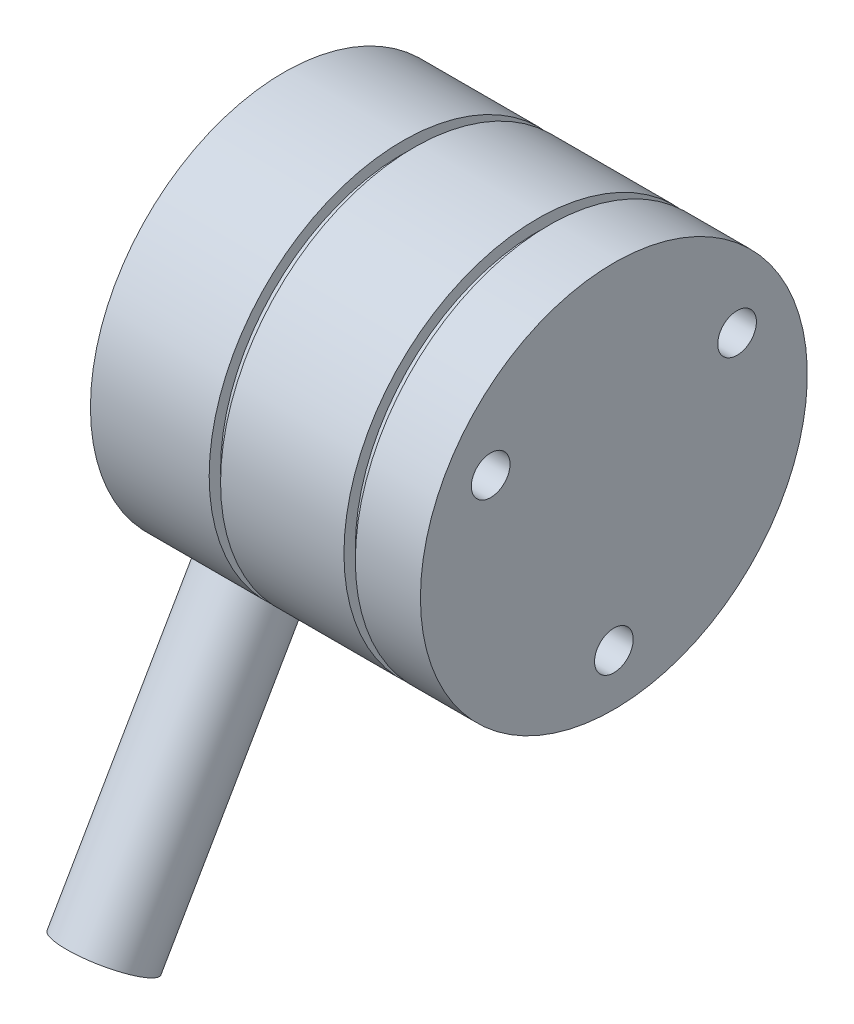
ISO-10303-21;
HEADER;
FILE_DESCRIPTION(('STEP AP214'),'2;1');
FILE_NAME('part.step','',(''),(''),'','','');
FILE_SCHEMA(('AUTOMOTIVE_DESIGN { 1 0 10303 214 1 1 1 1 }'));
ENDSEC;
DATA;
#1=APPLICATION_CONTEXT('core data for automotive mechanical design processes');
#2=APPLICATION_PROTOCOL_DEFINITION('international standard','automotive_design',2000,#1);
#3=PRODUCT_CONTEXT('',#1,'mechanical');
#4=PRODUCT('Part','Part','',(#3));
#5=PRODUCT_RELATED_PRODUCT_CATEGORY('part','',(#4));
#6=PRODUCT_DEFINITION_FORMATION('','',#4);
#7=PRODUCT_DEFINITION_CONTEXT('part definition',#1,'design');
#8=PRODUCT_DEFINITION('design','',#6,#7);
#9=PRODUCT_DEFINITION_SHAPE('','',#8);
#10=(LENGTH_UNIT() NAMED_UNIT(*) SI_UNIT(.MILLI.,.METRE.));
#11=(NAMED_UNIT(*) PLANE_ANGLE_UNIT() SI_UNIT($,.RADIAN.));
#12=(NAMED_UNIT(*) SI_UNIT($,.STERADIAN.) SOLID_ANGLE_UNIT());
#13=UNCERTAINTY_MEASURE_WITH_UNIT(LENGTH_MEASURE(1.E-05),#10,'distance_accuracy_value','');
#14=(GEOMETRIC_REPRESENTATION_CONTEXT(3) GLOBAL_UNCERTAINTY_ASSIGNED_CONTEXT((#13)) GLOBAL_UNIT_ASSIGNED_CONTEXT((#10,
#11,#12)) REPRESENTATION_CONTEXT('',''));
#15=CARTESIAN_POINT('',(0.,0.,0.));
#16=DIRECTION('',(0.,0.,1.));
#17=DIRECTION('',(1.,0.,0.));
#18=AXIS2_PLACEMENT_3D('',#15,#16,#17);
#19=CARTESIAN_POINT('',(0.,0.,0.));
#20=DIRECTION('',(1.,0.,0.));
#21=DIRECTION('',(0.,0.,-1.));
#22=AXIS2_PLACEMENT_3D('',#19,#20,#21);
#23=PLANE('',#22);
#24=CARTESIAN_POINT('',(0.,-5.11970027680622,-3.584852727194));
#25=DIRECTION('',(-1.,0.,0.));
#26=DIRECTION('',(0.,0.,1.));
#27=AXIS2_PLACEMENT_3D('',#24,#25,#26);
#28=CIRCLE('',#27,0.85);
#29=CARTESIAN_POINT('',(0.,-5.11970027680622,-2.734852727194));
#30=VERTEX_POINT('',#29);
#31=EDGE_CURVE('E83',#30,#30,#28,.T.);
#32=ORIENTED_EDGE('',*,*,#31,.F.);
#33=EDGE_LOOP('',(#32));
#34=FACE_BOUND('',#33,.T.);
#35=CARTESIAN_POINT('',(0.,-0.54472339217282,6.22621686307341));
#36=DIRECTION('',(-1.,0.,0.));
#37=DIRECTION('',(0.,0.,1.));
#38=AXIS2_PLACEMENT_3D('',#35,#36,#37);
#39=CIRCLE('',#38,0.850000000000001);
#40=CARTESIAN_POINT('',(0.,-0.54472339217282,7.07621686307341));
#41=VERTEX_POINT('',#40);
#42=EDGE_CURVE('E77',#41,#41,#39,.T.);
#43=ORIENTED_EDGE('',*,*,#42,.F.);
#44=EDGE_LOOP('',(#43));
#45=FACE_BOUND('',#44,.T.);
#46=CARTESIAN_POINT('',(0.,5.66442366897904,-2.64136413587941));
#47=DIRECTION('',(-1.,0.,0.));
#48=DIRECTION('',(0.,0.,1.));
#49=AXIS2_PLACEMENT_3D('',#46,#47,#48);
#50=CIRCLE('',#49,0.85);
#51=CARTESIAN_POINT('',(0.,5.66442366897904,-1.79136413587941));
#52=VERTEX_POINT('',#51);
#53=EDGE_CURVE('E71',#52,#52,#50,.T.);
#54=ORIENTED_EDGE('',*,*,#53,.F.);
#55=EDGE_LOOP('',(#54));
#56=FACE_BOUND('',#55,.T.);
#57=CARTESIAN_POINT('',(0.,0.,0.));
#58=DIRECTION('',(-1.,0.,0.));
#59=DIRECTION('',(0.,0.,1.));
#60=AXIS2_PLACEMENT_3D('',#57,#58,#59);
#61=CIRCLE('',#60,8.5);
#62=CARTESIAN_POINT('',(0.,0.,8.5));
#63=VERTEX_POINT('',#62);
#64=EDGE_CURVE('E10',#63,#63,#61,.T.);
#65=ORIENTED_EDGE('',*,*,#64,.T.);
#66=EDGE_LOOP('',(#65));
#67=FACE_BOUND('',#66,.T.);
#68=ADVANCED_FACE('F30',(#34,#45,#56,#67),#23,.F.);
#69=CARTESIAN_POINT('',(0.,0.,0.));
#70=DIRECTION('',(-1.,0.,0.));
#71=DIRECTION('',(0.,0.,1.));
#72=AXIS2_PLACEMENT_3D('',#69,#70,#71);
#73=CYLINDRICAL_SURFACE('',#72,8.5);
#74=CARTESIAN_POINT('',(2.69450578163428,-8.12495644586084,2.49701476825114));
#75=CARTESIAN_POINT('',(2.58922245366517,-8.12495651681742,2.49701889667136));
#76=CARTESIAN_POINT('',(2.48389710071612,-8.12232301708844,2.5056334997405));
#77=CARTESIAN_POINT('',(2.2762459099473,-8.11172218820042,2.53973826617043));
#78=CARTESIAN_POINT('',(2.17392223132134,-8.10375111323153,2.56524028065942));
#79=CARTESIAN_POINT('',(1.9753081137902,-8.08230627577559,2.6320230588623));
#80=CARTESIAN_POINT('',(1.87901102771537,-8.06883870370085,2.67328606846508));
#81=CARTESIAN_POINT('',(1.69490513126177,-8.03615154267094,2.76999319739295));
#82=CARTESIAN_POINT('',(1.60709622547668,-8.0169320183771,2.8254371573));
#83=CARTESIAN_POINT('',(1.44090981250331,-7.97212522983649,2.94951297408446));
#84=CARTESIAN_POINT('',(1.3627038254352,-7.94644187807409,3.01833990497959));
#85=CARTESIAN_POINT('',(1.21944670283871,-7.88867374574937,3.16624683806223));
#86=CARTESIAN_POINT('',(1.15439661829619,-7.85658845416159,3.24532765857489));
#87=CARTESIAN_POINT('',(1.03861595528015,-7.7856278404833,3.41207950109189));
#88=CARTESIAN_POINT('',(0.98805086604998,-7.74668167035503,3.49983549159466));
#89=CARTESIAN_POINT('',(0.903746981366496,-7.66258210802083,3.68031700081662));
#90=CARTESIAN_POINT('',(0.87000621238659,-7.61742944464207,3.77304193525488));
#91=CARTESIAN_POINT('',(0.82084965729554,-7.52247316644565,3.95892754320848));
#92=CARTESIAN_POINT('',(0.805143428580294,-7.47275761121485,4.0520563353672));
#93=CARTESIAN_POINT('',(0.79159318112935,-7.36926977580575,4.23734792817196));
#94=CARTESIAN_POINT('',(0.793747032000505,-7.31549798022371,4.32951084271711));
#95=CARTESIAN_POINT('',(0.815640565161463,-7.20650130968936,4.50856246954275));
#96=CARTESIAN_POINT('',(0.835067125845551,-7.15131922444454,4.59551579519775));
#97=CARTESIAN_POINT('',(0.890455033090359,-7.04044901861841,4.76363556254191));
#98=CARTESIAN_POINT('',(0.926417148678361,-6.98476087461966,4.84480173488225));
#99=CARTESIAN_POINT('',(1.01412881423263,-6.8744879559509,5.00005593350973));
#100=CARTESIAN_POINT('',(1.06599598872334,-6.81991474727515,5.07408563192728));
#101=CARTESIAN_POINT('',(1.18395753913208,-6.71444623952327,5.21285136042506));
#102=CARTESIAN_POINT('',(1.2500539331897,-6.6635514635308,5.2775860700176));
#103=CARTESIAN_POINT('',(1.39629872096011,-6.56651877210539,5.39786449455218));
#104=CARTESIAN_POINT('',(1.47672112987103,-6.52050817780424,5.45317805558689));
#105=CARTESIAN_POINT('',(1.64844221033773,-6.43669157523898,5.55186508677938));
#106=CARTESIAN_POINT('',(1.73974120370075,-6.39888580982586,5.59523820352756));
#107=CARTESIAN_POINT('',(1.93106201640173,-6.33329046933143,5.66938284197834));
#108=CARTESIAN_POINT('',(2.03111087787931,-6.30553341386585,5.70011349314742));
#109=CARTESIAN_POINT('',(2.23683330933762,-6.26175079790271,5.74817753946655));
#110=CARTESIAN_POINT('',(2.34250593992494,-6.24572328466138,5.7655131646583));
#111=CARTESIAN_POINT('',(2.55406804992012,-6.22654588569099,5.78621838296051));
#112=CARTESIAN_POINT('',(2.65990511419276,-6.22312935656193,5.78987717695539));
#113=CARTESIAN_POINT('',(2.87088002364778,-6.22863159675454,5.7839575032307));
#114=CARTESIAN_POINT('',(2.9760179186281,-6.23754947790143,5.77437998862974));
#115=CARTESIAN_POINT('',(3.18126098151566,-6.26701569172829,5.74238388895449));
#116=CARTESIAN_POINT('',(3.28141254972619,-6.28741764903466,5.7201268737841));
#117=CARTESIAN_POINT('',(3.47535519217186,-6.33864351027918,5.66330756460963));
#118=CARTESIAN_POINT('',(3.56914563443758,-6.36946844791099,5.62874405009685));
#119=CARTESIAN_POINT('',(3.74935942798676,-6.44056102177296,5.54726352757989));
#120=CARTESIAN_POINT('',(3.83564067685837,-6.48097202823825,5.50015747486314));
#121=CARTESIAN_POINT('',(3.99688296720361,-6.569034026753,5.39467349974679));
#122=CARTESIAN_POINT('',(4.07184253496696,-6.6166859597161,5.33629411217963));
#123=CARTESIAN_POINT('',(4.20981266193635,-6.71811308285792,5.20804733191299));
#124=CARTESIAN_POINT('',(4.27256100173142,-6.77198976045306,5.13797768214935));
#125=CARTESIAN_POINT('',(4.38244810520979,-6.88277230435679,4.98859493436632));
#126=CARTESIAN_POINT('',(4.42958761450308,-6.93967802582179,4.909282278116));
#127=CARTESIAN_POINT('',(4.50655845443923,-7.05384342589314,4.7437668746749));
#128=CARTESIAN_POINT('',(4.53650210668557,-7.11109828022495,4.65761312403072));
#129=CARTESIAN_POINT('',(4.57858036882856,-7.22419498330848,4.48018568382163));
#130=CARTESIAN_POINT('',(4.59071768904237,-7.28003704583056,4.38891277564437));
#131=CARTESIAN_POINT('',(4.59671237922055,-7.38726587030784,4.20586647625715));
#132=CARTESIAN_POINT('',(4.59096055430984,-7.43872299913613,4.11414688621883));
#133=CARTESIAN_POINT('',(4.56221742439062,-7.53711609687823,3.93099098523067));
#134=CARTESIAN_POINT('',(4.53922645643417,-7.58405215416576,3.83955466877748));
#135=CARTESIAN_POINT('',(4.47684842254765,-7.67228706691503,3.66005289612105));
#136=CARTESIAN_POINT('',(4.43751903789437,-7.71360508187903,3.57197675980916));
#137=CARTESIAN_POINT('',(4.34363598391497,-7.79027268675741,3.40152839471643));
#138=CARTESIAN_POINT('',(4.28908076702162,-7.82562166938749,3.31915674680769));
#139=CARTESIAN_POINT('',(4.16503233513158,-7.89080892129708,3.16110656892246));
#140=CARTESIAN_POINT('',(4.09526564846552,-7.92052471361278,3.08559214508521));
#141=CARTESIAN_POINT('',(3.94332337510274,-7.97364754693132,2.94560078491046));
#142=CARTESIAN_POINT('',(3.86114478333421,-7.9970530563062,2.88112652961894));
#143=CARTESIAN_POINT('',(3.68531718535809,-8.03806702926541,2.76466171388173));
#144=CARTESIAN_POINT('',(3.59152275369009,-8.0555890797072,2.71286003938622));
#145=CARTESIAN_POINT('',(3.39603208252516,-8.08465347295204,2.62498318723368));
#146=CARTESIAN_POINT('',(3.29434248038061,-8.09620077735547,2.58889496463575));
#147=CARTESIAN_POINT('',(3.10957317256238,-8.11161159243973,2.54012701860594));
#148=CARTESIAN_POINT('',(3.02748032617213,-8.1166217420282,2.52400052844593));
#149=CARTESIAN_POINT('',(2.86176903472646,-8.12329405153161,2.50244304769207));
#150=CARTESIAN_POINT('',(2.77815067103877,-8.12495638948768,2.49701148832773));
#151=CARTESIAN_POINT('',(2.69450578163428,-8.12495644586084,2.49701476825114));
#152=B_SPLINE_CURVE_WITH_KNOTS('',3,(#74,#75,#76,#77,#78,#79,#80,#81,#82,#83,#84,#85,#86,#87,
#88,#89,#90,#91,#92,#93,#94,#95,#96,#97,#98,#99,#100,#101,#102,#103,#104,#105,#106,#107,#108,
#109,#110,#111,#112,#113,#114,#115,#116,#117,#118,#119,#120,#121,#122,#123,#124,#125,#126,#127,
#128,#129,#130,#131,#132,#133,#134,#135,#136,#137,#138,#139,#140,#141,#142,#143,#144,#145,#146,
#147,#148,#149,#150,#151),.UNSPECIFIED.,.T.,.F.,(4,2,2,2,2,2,2,2,2,2,2,2,2,2,2,2,2,2,2,2,2,2,2,
2,2,2,2,2,2,2,2,2,2,2,2,2,2,2,4),(0.,0.315543347193396,0.631308369172636,0.946718738889866,
1.26212556301287,1.58253088499967,1.90296179311107,2.22691954912922,2.55083929530636,
2.86946579746667,3.18805429364004,3.50098253188484,3.81392532511121,4.12924067692428,
4.44460077961957,4.76681014538855,5.08902904678613,5.4122815826994,5.73548029101679,
6.05180489892881,6.36810673016085,6.68046542759518,6.99285511213133,7.310249616664,
7.62768539997577,7.95132633945162,8.27495181686322,8.5964386309337,8.91787650614,
9.23234197594749,9.5468012976264,9.86015975918354,10.1735500823821,10.4931231513841,
10.812773717275,11.1369324228212,11.4608215038932,11.7115258902928,11.9622169435435),.UNSPECIFIED.);
#153=CARTESIAN_POINT('',(2.69450578163428,-8.12495644586084,2.49701476825114));
#154=VERTEX_POINT('',#153);
#155=EDGE_CURVE('E33',#154,#154,#152,.T.);
#156=ORIENTED_EDGE('',*,*,#155,.T.);
#157=EDGE_LOOP('',(#156));
#158=FACE_BOUND('',#157,.T.);
#159=ORIENTED_EDGE('',*,*,#64,.F.);
#160=EDGE_LOOP('',(#159));
#161=FACE_BOUND('',#160,.T.);
#162=CARTESIAN_POINT('',(5.21775570966465,0.,0.));
#163=DIRECTION('',(-1.,0.,0.));
#164=DIRECTION('',(0.,0.,1.));
#165=AXIS2_PLACEMENT_3D('',#162,#163,#164);
#166=CIRCLE('',#165,8.5);
#167=CARTESIAN_POINT('',(5.21775570966465,0.,8.5));
#168=VERTEX_POINT('',#167);
#169=EDGE_CURVE('E40',#168,#168,#166,.T.);
#170=ORIENTED_EDGE('',*,*,#169,.T.);
#171=EDGE_LOOP('',(#170));
#172=FACE_BOUND('',#171,.T.);
#173=ADVANCED_FACE('F143',(#158,#161,#172),#73,.T.);
#174=CARTESIAN_POINT('',(5.21775570966465,8.5,0.));
#175=DIRECTION('',(-1.,0.,0.));
#176=DIRECTION('',(0.,0.,1.));
#177=AXIS2_PLACEMENT_3D('',#174,#175,#176);
#178=PLANE('',#177);
#179=ORIENTED_EDGE('',*,*,#169,.F.);
#180=EDGE_LOOP('',(#179));
#181=FACE_BOUND('',#180,.T.);
#182=CARTESIAN_POINT('',(5.21775570966465,0.,0.));
#183=DIRECTION('',(-1.,0.,0.));
#184=DIRECTION('',(0.,0.,1.));
#185=AXIS2_PLACEMENT_3D('',#182,#183,#184);
#186=CIRCLE('',#185,8.);
#187=CARTESIAN_POINT('',(5.21775570966465,0.,8.));
#188=VERTEX_POINT('',#187);
#189=EDGE_CURVE('E44',#188,#188,#186,.T.);
#190=ORIENTED_EDGE('',*,*,#189,.T.);
#191=EDGE_LOOP('',(#190));
#192=FACE_BOUND('',#191,.T.);
#193=ADVANCED_FACE('F148',(#181,#192),#178,.F.);
#194=CARTESIAN_POINT('',(0.,0.,0.));
#195=DIRECTION('',(-1.,0.,0.));
#196=DIRECTION('',(0.,0.,1.));
#197=AXIS2_PLACEMENT_3D('',#194,#195,#196);
#198=CYLINDRICAL_SURFACE('',#197,8.);
#199=ORIENTED_EDGE('',*,*,#189,.F.);
#200=EDGE_LOOP('',(#199));
#201=FACE_BOUND('',#200,.T.);
#202=CARTESIAN_POINT('',(5.71775570966465,0.,0.));
#203=DIRECTION('',(-1.,0.,0.));
#204=DIRECTION('',(0.,0.,1.));
#205=AXIS2_PLACEMENT_3D('',#202,#203,#204);
#206=CIRCLE('',#205,8.);
#207=CARTESIAN_POINT('',(5.71775570966465,0.,8.));
#208=VERTEX_POINT('',#207);
#209=EDGE_CURVE('E49',#208,#208,#206,.T.);
#210=ORIENTED_EDGE('',*,*,#209,.T.);
#211=EDGE_LOOP('',(#210));
#212=FACE_BOUND('',#211,.T.);
#213=ADVANCED_FACE('F318',(#201,#212),#198,.T.);
#214=CARTESIAN_POINT('',(5.71775570966465,8.,0.));
#215=DIRECTION('',(1.,0.,0.));
#216=DIRECTION('',(0.,0.,-1.));
#217=AXIS2_PLACEMENT_3D('',#214,#215,#216);
#218=PLANE('',#217);
#219=ORIENTED_EDGE('',*,*,#209,.F.);
#220=EDGE_LOOP('',(#219));
#221=FACE_BOUND('',#220,.T.);
#222=CARTESIAN_POINT('',(5.71775570966465,0.,0.));
#223=DIRECTION('',(-1.,0.,0.));
#224=DIRECTION('',(0.,0.,1.));
#225=AXIS2_PLACEMENT_3D('',#222,#223,#224);
#226=CIRCLE('',#225,8.5);
#227=CARTESIAN_POINT('',(5.71775570966465,0.,8.5));
#228=VERTEX_POINT('',#227);
#229=EDGE_CURVE('E52',#228,#228,#226,.T.);
#230=ORIENTED_EDGE('',*,*,#229,.T.);
#231=EDGE_LOOP('',(#230));
#232=FACE_BOUND('',#231,.T.);
#233=ADVANCED_FACE('F308',(#221,#232),#218,.F.);
#234=CARTESIAN_POINT('',(0.,0.,0.));
#235=DIRECTION('',(-1.,0.,0.));
#236=DIRECTION('',(0.,0.,1.));
#237=AXIS2_PLACEMENT_3D('',#234,#235,#236);
#238=CYLINDRICAL_SURFACE('',#237,8.5);
#239=ORIENTED_EDGE('',*,*,#229,.F.);
#240=EDGE_LOOP('',(#239));
#241=FACE_BOUND('',#240,.T.);
#242=CARTESIAN_POINT('',(11.1393085431913,0.,0.));
#243=DIRECTION('',(-1.,0.,0.));
#244=DIRECTION('',(0.,0.,1.));
#245=AXIS2_PLACEMENT_3D('',#242,#243,#244);
#246=CIRCLE('',#245,8.5);
#247=CARTESIAN_POINT('',(11.1393085431913,0.,8.5));
#248=VERTEX_POINT('',#247);
#249=EDGE_CURVE('E55',#248,#248,#246,.T.);
#250=ORIENTED_EDGE('',*,*,#249,.T.);
#251=EDGE_LOOP('',(#250));
#252=FACE_BOUND('',#251,.T.);
#253=ADVANCED_FACE('F298',(#241,#252),#238,.T.);
#254=CARTESIAN_POINT('',(11.1393085431913,8.5,0.));
#255=DIRECTION('',(-1.,0.,0.));
#256=DIRECTION('',(0.,0.,1.));
#257=AXIS2_PLACEMENT_3D('',#254,#255,#256);
#258=PLANE('',#257);
#259=ORIENTED_EDGE('',*,*,#249,.F.);
#260=EDGE_LOOP('',(#259));
#261=FACE_BOUND('',#260,.T.);
#262=CARTESIAN_POINT('',(11.1393085431913,0.,0.));
#263=DIRECTION('',(-1.,0.,0.));
#264=DIRECTION('',(0.,0.,1.));
#265=AXIS2_PLACEMENT_3D('',#262,#263,#264);
#266=CIRCLE('',#265,8.);
#267=CARTESIAN_POINT('',(11.1393085431913,0.,8.));
#268=VERTEX_POINT('',#267);
#269=EDGE_CURVE('E58',#268,#268,#266,.T.);
#270=ORIENTED_EDGE('',*,*,#269,.T.);
#271=EDGE_LOOP('',(#270));
#272=FACE_BOUND('',#271,.T.);
#273=ADVANCED_FACE('F288',(#261,#272),#258,.F.);
#274=CARTESIAN_POINT('',(0.,0.,0.));
#275=DIRECTION('',(-1.,0.,0.));
#276=DIRECTION('',(0.,0.,1.));
#277=AXIS2_PLACEMENT_3D('',#274,#275,#276);
#278=CYLINDRICAL_SURFACE('',#277,8.);
#279=ORIENTED_EDGE('',*,*,#269,.F.);
#280=EDGE_LOOP('',(#279));
#281=FACE_BOUND('',#280,.T.);
#282=CARTESIAN_POINT('',(11.6393085431913,0.,0.));
#283=DIRECTION('',(-1.,0.,0.));
#284=DIRECTION('',(0.,0.,1.));
#285=AXIS2_PLACEMENT_3D('',#282,#283,#284);
#286=CIRCLE('',#285,8.);
#287=CARTESIAN_POINT('',(11.6393085431913,0.,8.));
#288=VERTEX_POINT('',#287);
#289=EDGE_CURVE('E61',#288,#288,#286,.T.);
#290=ORIENTED_EDGE('',*,*,#289,.T.);
#291=EDGE_LOOP('',(#290));
#292=FACE_BOUND('',#291,.T.);
#293=ADVANCED_FACE('F138',(#281,#292),#278,.T.);
#294=CARTESIAN_POINT('',(11.6393085431913,8.,0.));
#295=DIRECTION('',(1.,0.,0.));
#296=DIRECTION('',(0.,0.,-1.));
#297=AXIS2_PLACEMENT_3D('',#294,#295,#296);
#298=PLANE('',#297);
#299=ORIENTED_EDGE('',*,*,#289,.F.);
#300=EDGE_LOOP('',(#299));
#301=FACE_BOUND('',#300,.T.);
#302=CARTESIAN_POINT('',(11.6393085431913,0.,0.));
#303=DIRECTION('',(-1.,0.,0.));
#304=DIRECTION('',(0.,0.,1.));
#305=AXIS2_PLACEMENT_3D('',#302,#303,#304);
#306=CIRCLE('',#305,8.5);
#307=CARTESIAN_POINT('',(11.6393085431913,0.,8.5));
#308=VERTEX_POINT('',#307);
#309=EDGE_CURVE('E64',#308,#308,#306,.T.);
#310=ORIENTED_EDGE('',*,*,#309,.T.);
#311=EDGE_LOOP('',(#310));
#312=FACE_BOUND('',#311,.T.);
#313=ADVANCED_FACE('F132',(#301,#312),#298,.F.);
#314=CARTESIAN_POINT('',(0.,0.,0.));
#315=DIRECTION('',(-1.,0.,0.));
#316=DIRECTION('',(0.,0.,1.));
#317=AXIS2_PLACEMENT_3D('',#314,#315,#316);
#318=CYLINDRICAL_SURFACE('',#317,8.5);
#319=ORIENTED_EDGE('',*,*,#309,.F.);
#320=EDGE_LOOP('',(#319));
#321=FACE_BOUND('',#320,.T.);
#322=CARTESIAN_POINT('',(14.5,0.,0.));
#323=DIRECTION('',(-1.,0.,0.));
#324=DIRECTION('',(0.,0.,1.));
#325=AXIS2_PLACEMENT_3D('',#322,#323,#324);
#326=CIRCLE('',#325,8.5);
#327=CARTESIAN_POINT('',(14.5,0.,8.5));
#328=VERTEX_POINT('',#327);
#329=EDGE_CURVE('E67',#328,#328,#326,.T.);
#330=ORIENTED_EDGE('',*,*,#329,.T.);
#331=EDGE_LOOP('',(#330));
#332=FACE_BOUND('',#331,.T.);
#333=ADVANCED_FACE('F123',(#321,#332),#318,.T.);
#334=CARTESIAN_POINT('',(14.5,8.5,0.));
#335=DIRECTION('',(-1.,0.,0.));
#336=DIRECTION('',(0.,0.,1.));
#337=AXIS2_PLACEMENT_3D('',#334,#335,#336);
#338=PLANE('',#337);
#339=CARTESIAN_POINT('',(14.5,3.125,-5.41265877365274));
#340=DIRECTION('',(1.,0.,0.));
#341=DIRECTION('',(0.,0.,-1.));
#342=AXIS2_PLACEMENT_3D('',#339,#340,#341);
#343=CIRCLE('',#342,0.85);
#344=CARTESIAN_POINT('',(14.5,3.125,-6.26265877365274));
#345=VERTEX_POINT('',#344);
#346=EDGE_CURVE('E104',#345,#345,#343,.T.);
#347=ORIENTED_EDGE('',*,*,#346,.F.);
#348=EDGE_LOOP('',(#347));
#349=FACE_BOUND('',#348,.T.);
#350=CARTESIAN_POINT('',(14.5,3.125,5.41265877365274));
#351=DIRECTION('',(1.,0.,0.));
#352=DIRECTION('',(0.,0.,-1.));
#353=AXIS2_PLACEMENT_3D('',#350,#351,#352);
#354=CIRCLE('',#353,0.849999999999998);
#355=CARTESIAN_POINT('',(14.5,3.125,4.56265877365275));
#356=VERTEX_POINT('',#355);
#357=EDGE_CURVE('E98',#356,#356,#354,.T.);
#358=ORIENTED_EDGE('',*,*,#357,.F.);
#359=EDGE_LOOP('',(#358));
#360=FACE_BOUND('',#359,.T.);
#361=CARTESIAN_POINT('',(14.5,-6.25,0.));
#362=DIRECTION('',(1.,0.,0.));
#363=DIRECTION('',(0.,0.,-1.));
#364=AXIS2_PLACEMENT_3D('',#361,#362,#363);
#365=CIRCLE('',#364,0.85);
#366=CARTESIAN_POINT('',(14.5,-6.25,-0.85));
#367=VERTEX_POINT('',#366);
#368=EDGE_CURVE('E92',#367,#367,#365,.T.);
#369=ORIENTED_EDGE('',*,*,#368,.F.);
#370=EDGE_LOOP('',(#369));
#371=FACE_BOUND('',#370,.T.);
#372=ORIENTED_EDGE('',*,*,#329,.F.);
#373=EDGE_LOOP('',(#372));
#374=FACE_BOUND('',#373,.T.);
#375=ADVANCED_FACE('F119',(#349,#360,#371,#374),#338,.F.);
#376=CARTESIAN_POINT('',(2.54,5.66442366897904,-2.64136413587941));
#377=DIRECTION('',(-1.,0.,0.));
#378=DIRECTION('',(0.,0.,1.));
#379=AXIS2_PLACEMENT_3D('',#376,#377,#378);
#380=CYLINDRICAL_SURFACE('',#379,0.85);
#381=CARTESIAN_POINT('',(2.54,5.66442366897904,-2.64136413587941));
#382=DIRECTION('',(-1.,0.,0.));
#383=DIRECTION('',(0.,0.,1.));
#384=AXIS2_PLACEMENT_3D('',#381,#382,#383);
#385=CIRCLE('',#384,0.85);
#386=CARTESIAN_POINT('',(2.54,5.66442366897904,-1.79136413587941));
#387=VERTEX_POINT('',#386);
#388=EDGE_CURVE('E70',#387,#387,#385,.T.);
#389=ORIENTED_EDGE('',*,*,#388,.F.);
#390=EDGE_LOOP('',(#389));
#391=FACE_BOUND('',#390,.T.);
#392=ORIENTED_EDGE('',*,*,#53,.T.);
#393=EDGE_LOOP('',(#392));
#394=FACE_BOUND('',#393,.T.);
#395=ADVANCED_FACE('F122',(#391,#394),#380,.F.);
#396=CARTESIAN_POINT('',(2.54,5.66442366897904,-2.64136413587941));
#397=DIRECTION('',(-1.,0.,0.));
#398=DIRECTION('',(0.,0.,1.));
#399=AXIS2_PLACEMENT_3D('',#396,#397,#398);
#400=PLANE('',#399);
#401=ORIENTED_EDGE('',*,*,#388,.T.);
#402=EDGE_LOOP('',(#401));
#403=FACE_BOUND('',#402,.T.);
#404=ADVANCED_FACE('F157',(#403),#400,.T.);
#405=CARTESIAN_POINT('',(2.54,-0.54472339217282,6.22621686307341));
#406=DIRECTION('',(-1.,0.,0.));
#407=DIRECTION('',(0.,0.,1.));
#408=AXIS2_PLACEMENT_3D('',#405,#406,#407);
#409=CYLINDRICAL_SURFACE('',#408,0.850000000000001);
#410=CARTESIAN_POINT('',(2.54,-0.54472339217282,6.22621686307341));
#411=DIRECTION('',(-1.,0.,0.));
#412=DIRECTION('',(0.,0.,1.));
#413=AXIS2_PLACEMENT_3D('',#410,#411,#412);
#414=CIRCLE('',#413,0.850000000000001);
#415=CARTESIAN_POINT('',(2.54,-0.54472339217282,7.07621686307341));
#416=VERTEX_POINT('',#415);
#417=EDGE_CURVE('E74',#416,#416,#414,.T.);
#418=ORIENTED_EDGE('',*,*,#417,.F.);
#419=EDGE_LOOP('',(#418));
#420=FACE_BOUND('',#419,.T.);
#421=ORIENTED_EDGE('',*,*,#42,.T.);
#422=EDGE_LOOP('',(#421));
#423=FACE_BOUND('',#422,.T.);
#424=ADVANCED_FACE('F163',(#420,#423),#409,.F.);
#425=CARTESIAN_POINT('',(2.54,-0.54472339217282,6.22621686307341));
#426=DIRECTION('',(-1.,0.,0.));
#427=DIRECTION('',(0.,0.,1.));
#428=AXIS2_PLACEMENT_3D('',#425,#426,#427);
#429=PLANE('',#428);
#430=ORIENTED_EDGE('',*,*,#417,.T.);
#431=EDGE_LOOP('',(#430));
#432=FACE_BOUND('',#431,.T.);
#433=ADVANCED_FACE('F170',(#432),#429,.T.);
#434=CARTESIAN_POINT('',(2.54,-5.11970027680622,-3.584852727194));
#435=DIRECTION('',(-1.,0.,0.));
#436=DIRECTION('',(0.,0.,1.));
#437=AXIS2_PLACEMENT_3D('',#434,#435,#436);
#438=CYLINDRICAL_SURFACE('',#437,0.85);
#439=CARTESIAN_POINT('',(2.54,-5.11970027680622,-3.584852727194));
#440=DIRECTION('',(-1.,0.,0.));
#441=DIRECTION('',(0.,0.,1.));
#442=AXIS2_PLACEMENT_3D('',#439,#440,#441);
#443=CIRCLE('',#442,0.85);
#444=CARTESIAN_POINT('',(2.54,-5.11970027680622,-2.734852727194));
#445=VERTEX_POINT('',#444);
#446=EDGE_CURVE('E80',#445,#445,#443,.T.);
#447=ORIENTED_EDGE('',*,*,#446,.F.);
#448=EDGE_LOOP('',(#447));
#449=FACE_BOUND('',#448,.T.);
#450=ORIENTED_EDGE('',*,*,#31,.T.);
#451=EDGE_LOOP('',(#450));
#452=FACE_BOUND('',#451,.T.);
#453=ADVANCED_FACE('F174',(#449,#452),#438,.F.);
#454=CARTESIAN_POINT('',(2.54,-5.11970027680622,-3.584852727194));
#455=DIRECTION('',(-1.,0.,0.));
#456=DIRECTION('',(0.,0.,1.));
#457=AXIS2_PLACEMENT_3D('',#454,#455,#456);
#458=PLANE('',#457);
#459=ORIENTED_EDGE('',*,*,#446,.T.);
#460=EDGE_LOOP('',(#459));
#461=FACE_BOUND('',#460,.T.);
#462=ADVANCED_FACE('F178',(#461),#458,.T.);
#463=CARTESIAN_POINT('',(2.69450578163428,-5.16151140655526,2.97999999999999));
#464=DIRECTION('',(0.,-0.86602540378444,0.499999999999998));
#465=DIRECTION('',(0.,-0.499999999999998,-0.86602540378444));
#466=AXIS2_PLACEMENT_3D('',#463,#464,#465);
#467=CYLINDRICAL_SURFACE('',#466,1.9);
#468=CARTESIAN_POINT('',(2.69450578163428,-18.3597385602301,10.6));
#469=DIRECTION('',(0.,-0.86602540378444,0.499999999999998));
#470=DIRECTION('',(0.,-0.499999999999998,-0.86602540378444));
#471=AXIS2_PLACEMENT_3D('',#468,#469,#470);
#472=CIRCLE('',#471,1.9);
#473=CARTESIAN_POINT('',(2.69450578163428,-19.3097385602301,8.95455173280952));
#474=VERTEX_POINT('',#473);
#475=EDGE_CURVE('E88',#474,#474,#472,.T.);
#476=ORIENTED_EDGE('',*,*,#475,.F.);
#477=EDGE_LOOP('',(#476));
#478=FACE_BOUND('',#477,.T.);
#479=ORIENTED_EDGE('',*,*,#155,.F.);
#480=EDGE_LOOP('',(#479));
#481=FACE_BOUND('',#480,.T.);
#482=ADVANCED_FACE('F181',(#478,#481),#467,.T.);
#483=CARTESIAN_POINT('',(2.69450578163428,-18.3597385602301,10.6));
#484=DIRECTION('',(0.,-0.86602540378444,0.499999999999998));
#485=DIRECTION('',(0.,-0.499999999999998,-0.86602540378444));
#486=AXIS2_PLACEMENT_3D('',#483,#484,#485);
#487=PLANE('',#486);
#488=ORIENTED_EDGE('',*,*,#475,.T.);
#489=EDGE_LOOP('',(#488));
#490=FACE_BOUND('',#489,.T.);
#491=ADVANCED_FACE('F186',(#490),#487,.T.);
#492=CARTESIAN_POINT('',(11.706,-6.25,0.));
#493=DIRECTION('',(1.,0.,0.));
#494=DIRECTION('',(0.,0.,-1.));
#495=AXIS2_PLACEMENT_3D('',#492,#493,#494);
#496=CYLINDRICAL_SURFACE('',#495,0.85);
#497=CARTESIAN_POINT('',(11.706,-6.25,0.));
#498=DIRECTION('',(1.,0.,0.));
#499=DIRECTION('',(0.,0.,-1.));
#500=AXIS2_PLACEMENT_3D('',#497,#498,#499);
#501=CIRCLE('',#500,0.85);
#502=CARTESIAN_POINT('',(11.706,-6.25,-0.85));
#503=VERTEX_POINT('',#502);
#504=EDGE_CURVE('E91',#503,#503,#501,.T.);
#505=ORIENTED_EDGE('',*,*,#504,.F.);
#506=EDGE_LOOP('',(#505));
#507=FACE_BOUND('',#506,.T.);
#508=ORIENTED_EDGE('',*,*,#368,.T.);
#509=EDGE_LOOP('',(#508));
#510=FACE_BOUND('',#509,.T.);
#511=ADVANCED_FACE('F190',(#507,#510),#496,.F.);
#512=CARTESIAN_POINT('',(11.706,-6.25,0.));
#513=DIRECTION('',(1.,0.,0.));
#514=DIRECTION('',(0.,0.,-1.));
#515=AXIS2_PLACEMENT_3D('',#512,#513,#514);
#516=PLANE('',#515);
#517=ORIENTED_EDGE('',*,*,#504,.T.);
#518=EDGE_LOOP('',(#517));
#519=FACE_BOUND('',#518,.T.);
#520=ADVANCED_FACE('F194',(#519),#516,.T.);
#521=CARTESIAN_POINT('',(11.706,3.125,5.41265877365274));
#522=DIRECTION('',(1.,0.,0.));
#523=DIRECTION('',(0.,0.,-1.));
#524=AXIS2_PLACEMENT_3D('',#521,#522,#523);
#525=CYLINDRICAL_SURFACE('',#524,0.849999999999998);
#526=CARTESIAN_POINT('',(11.706,3.125,5.41265877365274));
#527=DIRECTION('',(1.,0.,0.));
#528=DIRECTION('',(0.,0.,-1.));
#529=AXIS2_PLACEMENT_3D('',#526,#527,#528);
#530=CIRCLE('',#529,0.849999999999998);
#531=CARTESIAN_POINT('',(11.706,3.125,4.56265877365275));
#532=VERTEX_POINT('',#531);
#533=EDGE_CURVE('E95',#532,#532,#530,.T.);
#534=ORIENTED_EDGE('',*,*,#533,.F.);
#535=EDGE_LOOP('',(#534));
#536=FACE_BOUND('',#535,.T.);
#537=ORIENTED_EDGE('',*,*,#357,.T.);
#538=EDGE_LOOP('',(#537));
#539=FACE_BOUND('',#538,.T.);
#540=ADVANCED_FACE('F198',(#536,#539),#525,.F.);
#541=CARTESIAN_POINT('',(11.706,3.125,5.41265877365274));
#542=DIRECTION('',(1.,0.,0.));
#543=DIRECTION('',(0.,0.,-1.));
#544=AXIS2_PLACEMENT_3D('',#541,#542,#543);
#545=PLANE('',#544);
#546=ORIENTED_EDGE('',*,*,#533,.T.);
#547=EDGE_LOOP('',(#546));
#548=FACE_BOUND('',#547,.T.);
#549=ADVANCED_FACE('F115',(#548),#545,.T.);
#550=CARTESIAN_POINT('',(11.706,3.125,-5.41265877365274));
#551=DIRECTION('',(1.,0.,0.));
#552=DIRECTION('',(0.,0.,-1.));
#553=AXIS2_PLACEMENT_3D('',#550,#551,#552);
#554=CYLINDRICAL_SURFACE('',#553,0.85);
#555=CARTESIAN_POINT('',(11.706,3.125,-5.41265877365274));
#556=DIRECTION('',(1.,0.,0.));
#557=DIRECTION('',(0.,0.,-1.));
#558=AXIS2_PLACEMENT_3D('',#555,#556,#557);
#559=CIRCLE('',#558,0.85);
#560=CARTESIAN_POINT('',(11.706,3.125,-6.26265877365274));
#561=VERTEX_POINT('',#560);
#562=EDGE_CURVE('E101',#561,#561,#559,.T.);
#563=ORIENTED_EDGE('',*,*,#562,.F.);
#564=EDGE_LOOP('',(#563));
#565=FACE_BOUND('',#564,.T.);
#566=ORIENTED_EDGE('',*,*,#346,.T.);
#567=EDGE_LOOP('',(#566));
#568=FACE_BOUND('',#567,.T.);
#569=ADVANCED_FACE('F112',(#565,#568),#554,.F.);
#570=CARTESIAN_POINT('',(11.706,3.125,-5.41265877365274));
#571=DIRECTION('',(1.,0.,0.));
#572=DIRECTION('',(0.,0.,-1.));
#573=AXIS2_PLACEMENT_3D('',#570,#571,#572);
#574=PLANE('',#573);
#575=ORIENTED_EDGE('',*,*,#562,.T.);
#576=EDGE_LOOP('',(#575));
#577=FACE_BOUND('',#576,.T.);
#578=ADVANCED_FACE('F110',(#577),#574,.T.);
#579=CLOSED_SHELL('',(#68,#173,#193,#213,#233,#253,#273,#293,#313,#333,#375,#395,#404,#424,#433,
#453,#462,#482,#491,#511,#520,#540,#549,#569,#578));
#580=MANIFOLD_SOLID_BREP('B2',#579);
#581=ADVANCED_BREP_SHAPE_REPRESENTATION('',(#18,#580),#14);
#582=SHAPE_DEFINITION_REPRESENTATION(#9,#581);
ENDSEC;
END-ISO-10303-21;
